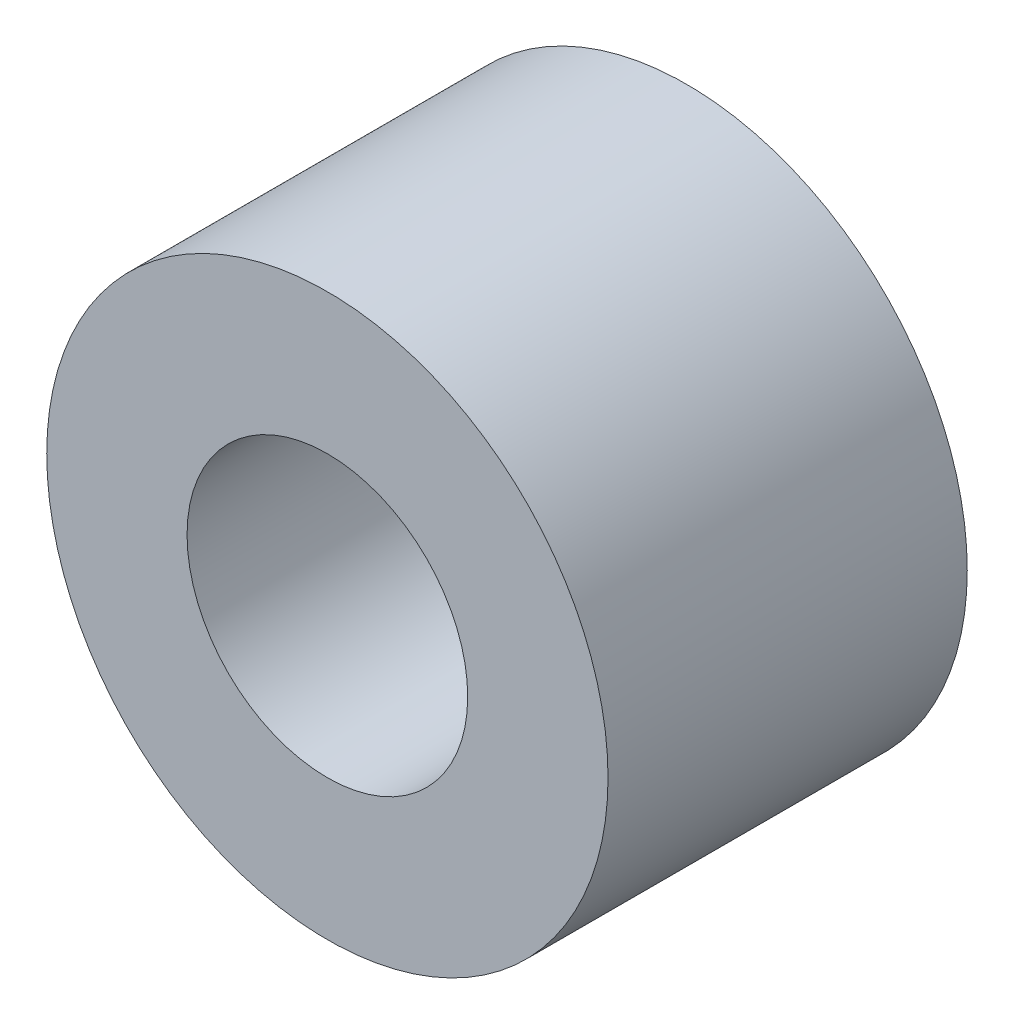
ISO-10303-21;
HEADER;
FILE_DESCRIPTION(('STEP AP214'),'2;1');
FILE_NAME('part.step','',(''),(''),'','','');
FILE_SCHEMA(('AUTOMOTIVE_DESIGN { 1 0 10303 214 1 1 1 1 }'));
ENDSEC;
DATA;
#1=APPLICATION_CONTEXT('core data for automotive mechanical design processes');
#2=APPLICATION_PROTOCOL_DEFINITION('international standard','automotive_design',2000,#1);
#3=PRODUCT_CONTEXT('',#1,'mechanical');
#4=PRODUCT('Part','Part','',(#3));
#5=PRODUCT_RELATED_PRODUCT_CATEGORY('part','',(#4));
#6=PRODUCT_DEFINITION_FORMATION('','',#4);
#7=PRODUCT_DEFINITION_CONTEXT('part definition',#1,'design');
#8=PRODUCT_DEFINITION('design','',#6,#7);
#9=PRODUCT_DEFINITION_SHAPE('','',#8);
#10=(LENGTH_UNIT() NAMED_UNIT(*) SI_UNIT(.MILLI.,.METRE.));
#11=(NAMED_UNIT(*) PLANE_ANGLE_UNIT() SI_UNIT($,.RADIAN.));
#12=(NAMED_UNIT(*) SI_UNIT($,.STERADIAN.) SOLID_ANGLE_UNIT());
#13=UNCERTAINTY_MEASURE_WITH_UNIT(LENGTH_MEASURE(1.E-05),#10,'distance_accuracy_value','');
#14=(GEOMETRIC_REPRESENTATION_CONTEXT(3) GLOBAL_UNCERTAINTY_ASSIGNED_CONTEXT((#13)) GLOBAL_UNIT_ASSIGNED_CONTEXT((#10,
#11,#12)) REPRESENTATION_CONTEXT('',''));
#15=CARTESIAN_POINT('',(0.,0.,0.));
#16=DIRECTION('',(0.,0.,1.));
#17=DIRECTION('',(1.,0.,0.));
#18=AXIS2_PLACEMENT_3D('',#15,#16,#17);
#19=CARTESIAN_POINT('',(0.,0.,8.128));
#20=DIRECTION('',(0.,0.,1.));
#21=DIRECTION('',(1.,0.,0.));
#22=AXIS2_PLACEMENT_3D('',#19,#20,#21);
#23=PLANE('',#22);
#24=CARTESIAN_POINT('',(0.,0.,8.128));
#25=DIRECTION('',(0.,0.,1.));
#26=DIRECTION('',(1.,0.,0.));
#27=AXIS2_PLACEMENT_3D('',#24,#25,#26);
#28=CIRCLE('',#27,6.35);
#29=CARTESIAN_POINT('',(6.35,0.,8.128));
#30=VERTEX_POINT('',#29);
#31=EDGE_CURVE('E10',#30,#30,#28,.T.);
#32=ORIENTED_EDGE('',*,*,#31,.T.);
#33=EDGE_LOOP('',(#32));
#34=FACE_BOUND('',#33,.T.);
#35=CARTESIAN_POINT('',(0.,0.,8.128));
#36=DIRECTION('',(0.,0.,1.));
#37=DIRECTION('',(1.,0.,0.));
#38=AXIS2_PLACEMENT_3D('',#35,#36,#37);
#39=CIRCLE('',#38,3.175);
#40=CARTESIAN_POINT('',(3.175,0.,8.128));
#41=VERTEX_POINT('',#40);
#42=EDGE_CURVE('E45',#41,#41,#39,.T.);
#43=ORIENTED_EDGE('',*,*,#42,.F.);
#44=EDGE_LOOP('',(#43));
#45=FACE_BOUND('',#44,.T.);
#46=ADVANCED_FACE('F34',(#34,#45),#23,.T.);
#47=CARTESIAN_POINT('',(0.,0.,0.));
#48=DIRECTION('',(0.,0.,1.));
#49=DIRECTION('',(1.,0.,0.));
#50=AXIS2_PLACEMENT_3D('',#47,#48,#49);
#51=PLANE('',#50);
#52=CARTESIAN_POINT('',(0.,0.,0.));
#53=DIRECTION('',(0.,0.,1.));
#54=DIRECTION('',(1.,0.,0.));
#55=AXIS2_PLACEMENT_3D('',#52,#53,#54);
#56=CIRCLE('',#55,6.35);
#57=CARTESIAN_POINT('',(6.35,0.,0.));
#58=VERTEX_POINT('',#57);
#59=EDGE_CURVE('E38',#58,#58,#56,.T.);
#60=ORIENTED_EDGE('',*,*,#59,.F.);
#61=EDGE_LOOP('',(#60));
#62=FACE_BOUND('',#61,.T.);
#63=CARTESIAN_POINT('',(0.,0.,0.));
#64=DIRECTION('',(0.,0.,1.));
#65=DIRECTION('',(1.,0.,0.));
#66=AXIS2_PLACEMENT_3D('',#63,#64,#65);
#67=CIRCLE('',#66,3.175);
#68=CARTESIAN_POINT('',(3.175,0.,0.));
#69=VERTEX_POINT('',#68);
#70=EDGE_CURVE('E47',#69,#69,#67,.T.);
#71=ORIENTED_EDGE('',*,*,#70,.T.);
#72=EDGE_LOOP('',(#71));
#73=FACE_BOUND('',#72,.T.);
#74=ADVANCED_FACE('F57',(#62,#73),#51,.F.);
#75=CARTESIAN_POINT('',(0.,0.,8.128));
#76=DIRECTION('',(0.,0.,-1.));
#77=DIRECTION('',(-1.,0.,0.));
#78=AXIS2_PLACEMENT_3D('',#75,#76,#77);
#79=CYLINDRICAL_SURFACE('',#78,6.35);
#80=ORIENTED_EDGE('',*,*,#31,.F.);
#81=EDGE_LOOP('',(#80));
#82=FACE_BOUND('',#81,.T.);
#83=ORIENTED_EDGE('',*,*,#59,.T.);
#84=EDGE_LOOP('',(#83));
#85=FACE_BOUND('',#84,.T.);
#86=ADVANCED_FACE('F36',(#82,#85),#79,.T.);
#87=CARTESIAN_POINT('',(0.,0.,8.128));
#88=DIRECTION('',(0.,0.,-1.));
#89=DIRECTION('',(-1.,0.,0.));
#90=AXIS2_PLACEMENT_3D('',#87,#88,#89);
#91=CYLINDRICAL_SURFACE('',#90,3.175);
#92=ORIENTED_EDGE('',*,*,#42,.T.);
#93=EDGE_LOOP('',(#92));
#94=FACE_BOUND('',#93,.T.);
#95=ORIENTED_EDGE('',*,*,#70,.F.);
#96=EDGE_LOOP('',(#95));
#97=FACE_BOUND('',#96,.T.);
#98=ADVANCED_FACE('F53',(#94,#97),#91,.F.);
#99=CLOSED_SHELL('',(#46,#74,#86,#98));
#100=MANIFOLD_SOLID_BREP('B2',#99);
#101=ADVANCED_BREP_SHAPE_REPRESENTATION('',(#18,#100),#14);
#102=SHAPE_DEFINITION_REPRESENTATION(#9,#101);
ENDSEC;
END-ISO-10303-21;
